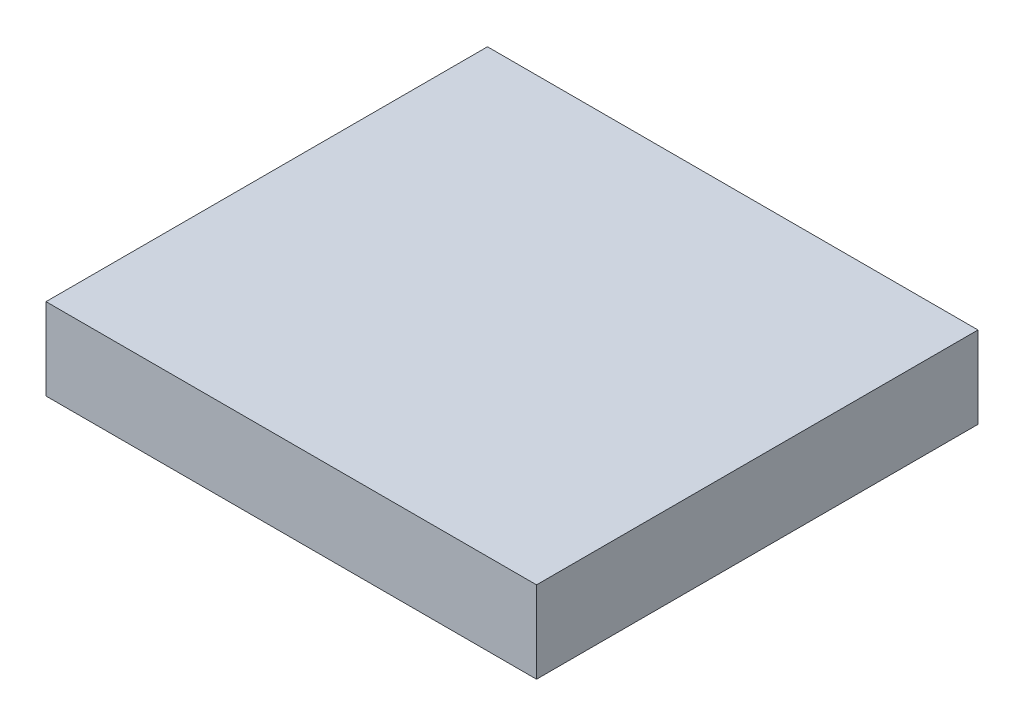
ISO-10303-21;
HEADER;
FILE_DESCRIPTION(('STEP AP214'),'2;1');
FILE_NAME('part.step','',(''),(''),'','','');
FILE_SCHEMA(('AUTOMOTIVE_DESIGN { 1 0 10303 214 1 1 1 1 }'));
ENDSEC;
DATA;
#1=APPLICATION_CONTEXT('core data for automotive mechanical design processes');
#2=APPLICATION_PROTOCOL_DEFINITION('international standard','automotive_design',2000,#1);
#3=PRODUCT_CONTEXT('',#1,'mechanical');
#4=PRODUCT('Part','Part','',(#3));
#5=PRODUCT_RELATED_PRODUCT_CATEGORY('part','',(#4));
#6=PRODUCT_DEFINITION_FORMATION('','',#4);
#7=PRODUCT_DEFINITION_CONTEXT('part definition',#1,'design');
#8=PRODUCT_DEFINITION('design','',#6,#7);
#9=PRODUCT_DEFINITION_SHAPE('','',#8);
#10=(LENGTH_UNIT() NAMED_UNIT(*) SI_UNIT(.MILLI.,.METRE.));
#11=(NAMED_UNIT(*) PLANE_ANGLE_UNIT() SI_UNIT($,.RADIAN.));
#12=(NAMED_UNIT(*) SI_UNIT($,.STERADIAN.) SOLID_ANGLE_UNIT());
#13=UNCERTAINTY_MEASURE_WITH_UNIT(LENGTH_MEASURE(1.E-05),#10,'distance_accuracy_value','');
#14=(GEOMETRIC_REPRESENTATION_CONTEXT(3) GLOBAL_UNCERTAINTY_ASSIGNED_CONTEXT((#13)) GLOBAL_UNIT_ASSIGNED_CONTEXT((#10,
#11,#12)) REPRESENTATION_CONTEXT('',''));
#15=CARTESIAN_POINT('',(0.,0.,0.));
#16=DIRECTION('',(0.,0.,1.));
#17=DIRECTION('',(1.,0.,0.));
#18=AXIS2_PLACEMENT_3D('',#15,#16,#17);
#19=CARTESIAN_POINT('',(0.,10.,0.));
#20=DIRECTION('',(1.,0.,0.));
#21=DIRECTION('',(0.,0.,-1.));
#22=AXIS2_PLACEMENT_3D('',#19,#20,#21);
#23=PLANE('',#22);
#24=DIRECTION('',(0.,0.,1.));
#25=VECTOR('',#24,1.);
#26=CARTESIAN_POINT('',(0.,0.,0.));
#27=LINE('',#26,#25);
#28=CARTESIAN_POINT('',(0.,0.,0.));
#29=VERTEX_POINT('',#28);
#30=CARTESIAN_POINT('',(0.,0.,54.));
#31=VERTEX_POINT('',#30);
#32=EDGE_CURVE('E107',#29,#31,#27,.T.);
#33=ORIENTED_EDGE('',*,*,#32,.T.);
#34=DIRECTION('',(0.,-1.,0.));
#35=VECTOR('',#34,1.);
#36=CARTESIAN_POINT('',(0.,10.,54.));
#37=LINE('',#36,#35);
#38=CARTESIAN_POINT('',(0.,10.,54.));
#39=VERTEX_POINT('',#38);
#40=EDGE_CURVE('E11',#39,#31,#37,.T.);
#41=ORIENTED_EDGE('',*,*,#40,.F.);
#42=DIRECTION('',(0.,0.,1.));
#43=VECTOR('',#42,1.);
#44=CARTESIAN_POINT('',(0.,10.,0.));
#45=LINE('',#44,#43);
#46=CARTESIAN_POINT('',(0.,10.,0.));
#47=VERTEX_POINT('',#46);
#48=EDGE_CURVE('E91',#47,#39,#45,.T.);
#49=ORIENTED_EDGE('',*,*,#48,.F.);
#50=DIRECTION('',(0.,-1.,0.));
#51=VECTOR('',#50,1.);
#52=CARTESIAN_POINT('',(0.,10.,0.));
#53=LINE('',#52,#51);
#54=EDGE_CURVE('E103',#47,#29,#53,.T.);
#55=ORIENTED_EDGE('',*,*,#54,.T.);
#56=EDGE_LOOP('',(#33,#41,#49,#55));
#57=FACE_BOUND('',#56,.T.);
#58=ADVANCED_FACE('F39',(#57),#23,.F.);
#59=CARTESIAN_POINT('',(0.,10.,54.));
#60=DIRECTION('',(0.,0.,-1.));
#61=DIRECTION('',(-1.,0.,0.));
#62=AXIS2_PLACEMENT_3D('',#59,#60,#61);
#63=PLANE('',#62);
#64=DIRECTION('',(1.,0.,0.));
#65=VECTOR('',#64,1.);
#66=CARTESIAN_POINT('',(0.,0.,54.));
#67=LINE('',#66,#65);
#68=CARTESIAN_POINT('',(60.,0.,54.));
#69=VERTEX_POINT('',#68);
#70=EDGE_CURVE('E96',#31,#69,#67,.T.);
#71=ORIENTED_EDGE('',*,*,#70,.T.);
#72=DIRECTION('',(0.,-1.,0.));
#73=VECTOR('',#72,1.);
#74=CARTESIAN_POINT('',(60.,10.,54.));
#75=LINE('',#74,#73);
#76=CARTESIAN_POINT('',(60.,10.,54.));
#77=VERTEX_POINT('',#76);
#78=EDGE_CURVE('E48',#77,#69,#75,.T.);
#79=ORIENTED_EDGE('',*,*,#78,.F.);
#80=DIRECTION('',(1.,0.,0.));
#81=VECTOR('',#80,1.);
#82=CARTESIAN_POINT('',(0.,10.,54.));
#83=LINE('',#82,#81);
#84=EDGE_CURVE('E86',#39,#77,#83,.T.);
#85=ORIENTED_EDGE('',*,*,#84,.F.);
#86=ORIENTED_EDGE('',*,*,#40,.T.);
#87=EDGE_LOOP('',(#71,#79,#85,#86));
#88=FACE_BOUND('',#87,.T.);
#89=ADVANCED_FACE('F95',(#88),#63,.F.);
#90=CARTESIAN_POINT('',(60.,10.,0.));
#91=DIRECTION('',(-1.,0.,0.));
#92=DIRECTION('',(0.,0.,1.));
#93=AXIS2_PLACEMENT_3D('',#90,#91,#92);
#94=PLANE('',#93);
#95=DIRECTION('',(0.,0.,-1.));
#96=VECTOR('',#95,1.);
#97=CARTESIAN_POINT('',(60.,0.,0.));
#98=LINE('',#97,#96);
#99=CARTESIAN_POINT('',(60.,0.,0.));
#100=VERTEX_POINT('',#99);
#101=EDGE_CURVE('E73',#69,#100,#98,.T.);
#102=ORIENTED_EDGE('',*,*,#101,.T.);
#103=DIRECTION('',(0.,-1.,0.));
#104=VECTOR('',#103,1.);
#105=CARTESIAN_POINT('',(60.,10.,0.));
#106=LINE('',#105,#104);
#107=CARTESIAN_POINT('',(60.,10.,0.));
#108=VERTEX_POINT('',#107);
#109=EDGE_CURVE('E98',#108,#100,#106,.T.);
#110=ORIENTED_EDGE('',*,*,#109,.F.);
#111=DIRECTION('',(0.,0.,-1.));
#112=VECTOR('',#111,1.);
#113=CARTESIAN_POINT('',(60.,10.,0.));
#114=LINE('',#113,#112);
#115=EDGE_CURVE('E89',#77,#108,#114,.T.);
#116=ORIENTED_EDGE('',*,*,#115,.F.);
#117=ORIENTED_EDGE('',*,*,#78,.T.);
#118=EDGE_LOOP('',(#102,#110,#116,#117));
#119=FACE_BOUND('',#118,.T.);
#120=ADVANCED_FACE('F99',(#119),#94,.F.);
#121=CARTESIAN_POINT('',(0.,10.,0.));
#122=DIRECTION('',(0.,0.,1.));
#123=DIRECTION('',(1.,0.,0.));
#124=AXIS2_PLACEMENT_3D('',#121,#122,#123);
#125=PLANE('',#124);
#126=DIRECTION('',(-1.,0.,0.));
#127=VECTOR('',#126,1.);
#128=CARTESIAN_POINT('',(0.,0.,0.));
#129=LINE('',#128,#127);
#130=EDGE_CURVE('E79',#100,#29,#129,.T.);
#131=ORIENTED_EDGE('',*,*,#130,.T.);
#132=ORIENTED_EDGE('',*,*,#54,.F.);
#133=DIRECTION('',(-1.,0.,0.));
#134=VECTOR('',#133,1.);
#135=CARTESIAN_POINT('',(0.,10.,0.));
#136=LINE('',#135,#134);
#137=EDGE_CURVE('E56',#108,#47,#136,.T.);
#138=ORIENTED_EDGE('',*,*,#137,.F.);
#139=ORIENTED_EDGE('',*,*,#109,.T.);
#140=EDGE_LOOP('',(#131,#132,#138,#139));
#141=FACE_BOUND('',#140,.T.);
#142=ADVANCED_FACE('F120',(#141),#125,.F.);
#143=CARTESIAN_POINT('',(0.,10.,0.));
#144=DIRECTION('',(0.,1.,0.));
#145=DIRECTION('',(0.,0.,1.));
#146=AXIS2_PLACEMENT_3D('',#143,#144,#145);
#147=PLANE('',#146);
#148=ORIENTED_EDGE('',*,*,#48,.T.);
#149=ORIENTED_EDGE('',*,*,#84,.T.);
#150=ORIENTED_EDGE('',*,*,#115,.T.);
#151=ORIENTED_EDGE('',*,*,#137,.T.);
#152=EDGE_LOOP('',(#148,#149,#150,#151));
#153=FACE_BOUND('',#152,.T.);
#154=ADVANCED_FACE('F87',(#153),#147,.T.);
#155=CARTESIAN_POINT('',(0.,0.,0.));
#156=DIRECTION('',(0.,1.,0.));
#157=DIRECTION('',(0.,0.,1.));
#158=AXIS2_PLACEMENT_3D('',#155,#156,#157);
#159=PLANE('',#158);
#160=ORIENTED_EDGE('',*,*,#32,.F.);
#161=ORIENTED_EDGE('',*,*,#130,.F.);
#162=ORIENTED_EDGE('',*,*,#101,.F.);
#163=ORIENTED_EDGE('',*,*,#70,.F.);
#164=EDGE_LOOP('',(#160,#161,#162,#163));
#165=FACE_BOUND('',#164,.T.);
#166=ADVANCED_FACE('F123',(#165),#159,.F.);
#167=CLOSED_SHELL('',(#58,#89,#120,#142,#154,#166));
#168=MANIFOLD_SOLID_BREP('B2',#167);
#169=ADVANCED_BREP_SHAPE_REPRESENTATION('',(#18,#168),#14);
#170=SHAPE_DEFINITION_REPRESENTATION(#9,#169);
ENDSEC;
END-ISO-10303-21;
